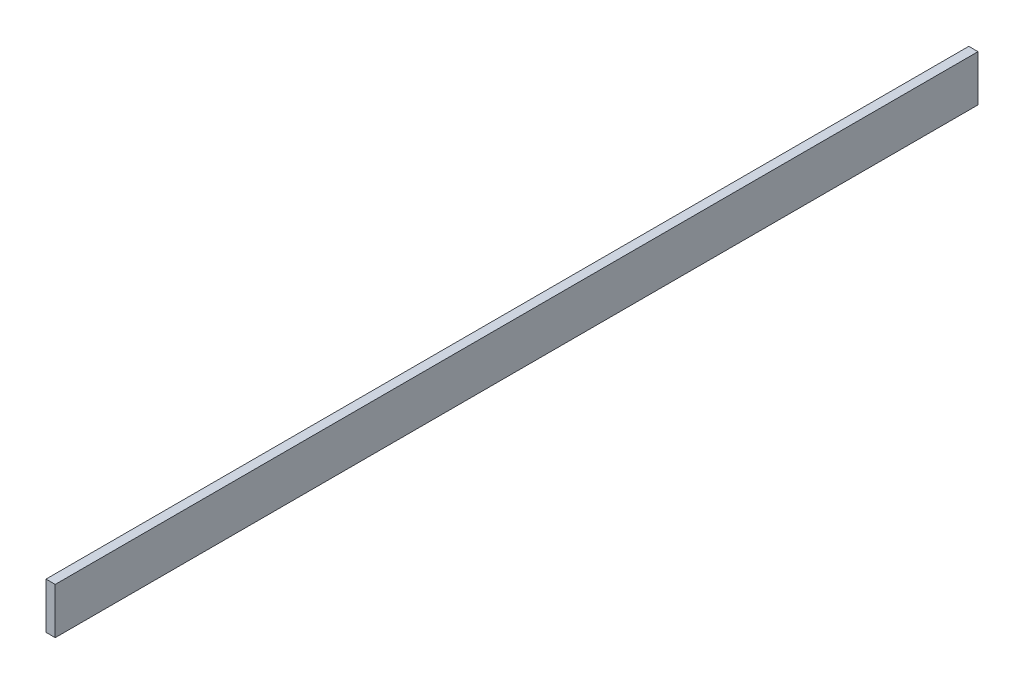
ISO-10303-21;
HEADER;
FILE_DESCRIPTION(('STEP AP214'),'2;1');
FILE_NAME('part.step','',(''),(''),'','','');
FILE_SCHEMA(('AUTOMOTIVE_DESIGN { 1 0 10303 214 1 1 1 1 }'));
ENDSEC;
DATA;
#1=APPLICATION_CONTEXT('core data for automotive mechanical design processes');
#2=APPLICATION_PROTOCOL_DEFINITION('international standard','automotive_design',2000,#1);
#3=PRODUCT_CONTEXT('',#1,'mechanical');
#4=PRODUCT('Part','Part','',(#3));
#5=PRODUCT_RELATED_PRODUCT_CATEGORY('part','',(#4));
#6=PRODUCT_DEFINITION_FORMATION('','',#4);
#7=PRODUCT_DEFINITION_CONTEXT('part definition',#1,'design');
#8=PRODUCT_DEFINITION('design','',#6,#7);
#9=PRODUCT_DEFINITION_SHAPE('','',#8);
#10=(LENGTH_UNIT() NAMED_UNIT(*) SI_UNIT(.MILLI.,.METRE.));
#11=(NAMED_UNIT(*) PLANE_ANGLE_UNIT() SI_UNIT($,.RADIAN.));
#12=(NAMED_UNIT(*) SI_UNIT($,.STERADIAN.) SOLID_ANGLE_UNIT());
#13=UNCERTAINTY_MEASURE_WITH_UNIT(LENGTH_MEASURE(1.E-05),#10,'distance_accuracy_value','');
#14=(GEOMETRIC_REPRESENTATION_CONTEXT(3) GLOBAL_UNCERTAINTY_ASSIGNED_CONTEXT((#13)) GLOBAL_UNIT_ASSIGNED_CONTEXT((#10,
#11,#12)) REPRESENTATION_CONTEXT('',''));
#15=CARTESIAN_POINT('',(0.,0.,0.));
#16=DIRECTION('',(0.,0.,1.));
#17=DIRECTION('',(1.,0.,0.));
#18=AXIS2_PLACEMENT_3D('',#15,#16,#17);
#19=CARTESIAN_POINT('',(9.99999999999999,50.,2000.));
#20=DIRECTION('',(-1.,0.,0.));
#21=DIRECTION('',(0.,-1.,0.));
#22=AXIS2_PLACEMENT_3D('',#19,#20,#21);
#23=PLANE('',#22);
#24=DIRECTION('',(0.,1.,0.));
#25=VECTOR('',#24,1.);
#26=CARTESIAN_POINT('',(9.99999999999999,50.,0.));
#27=LINE('',#26,#25);
#28=CARTESIAN_POINT('',(10.,-50.,0.));
#29=VERTEX_POINT('',#28);
#30=CARTESIAN_POINT('',(9.99999999999999,50.,0.));
#31=VERTEX_POINT('',#30);
#32=EDGE_CURVE('E98',#29,#31,#27,.T.);
#33=ORIENTED_EDGE('',*,*,#32,.T.);
#34=DIRECTION('',(0.,0.,-1.));
#35=VECTOR('',#34,1.);
#36=CARTESIAN_POINT('',(9.99999999999999,50.,2000.));
#37=LINE('',#36,#35);
#38=CARTESIAN_POINT('',(9.99999999999999,50.,2000.));
#39=VERTEX_POINT('',#38);
#40=EDGE_CURVE('E11',#39,#31,#37,.T.);
#41=ORIENTED_EDGE('',*,*,#40,.F.);
#42=DIRECTION('',(0.,1.,0.));
#43=VECTOR('',#42,1.);
#44=CARTESIAN_POINT('',(9.99999999999999,50.,2000.));
#45=LINE('',#44,#43);
#46=CARTESIAN_POINT('',(10.,-50.,2000.));
#47=VERTEX_POINT('',#46);
#48=EDGE_CURVE('E86',#47,#39,#45,.T.);
#49=ORIENTED_EDGE('',*,*,#48,.F.);
#50=DIRECTION('',(0.,0.,-1.));
#51=VECTOR('',#50,1.);
#52=CARTESIAN_POINT('',(10.,-50.,2000.));
#53=LINE('',#52,#51);
#54=EDGE_CURVE('E94',#47,#29,#53,.T.);
#55=ORIENTED_EDGE('',*,*,#54,.T.);
#56=EDGE_LOOP('',(#33,#41,#49,#55));
#57=FACE_BOUND('',#56,.T.);
#58=ADVANCED_FACE('F35',(#57),#23,.F.);
#59=CARTESIAN_POINT('',(-10.,50.,2000.));
#60=DIRECTION('',(0.,-1.,0.));
#61=DIRECTION('',(0.,0.,-1.));
#62=AXIS2_PLACEMENT_3D('',#59,#60,#61);
#63=PLANE('',#62);
#64=DIRECTION('',(-1.,0.,0.));
#65=VECTOR('',#64,1.);
#66=CARTESIAN_POINT('',(-10.,50.,0.));
#67=LINE('',#66,#65);
#68=CARTESIAN_POINT('',(-10.,50.,0.));
#69=VERTEX_POINT('',#68);
#70=EDGE_CURVE('E90',#31,#69,#67,.T.);
#71=ORIENTED_EDGE('',*,*,#70,.T.);
#72=DIRECTION('',(0.,0.,-1.));
#73=VECTOR('',#72,1.);
#74=CARTESIAN_POINT('',(-10.,50.,2000.));
#75=LINE('',#74,#73);
#76=CARTESIAN_POINT('',(-10.,50.,2000.));
#77=VERTEX_POINT('',#76);
#78=EDGE_CURVE('E43',#77,#69,#75,.T.);
#79=ORIENTED_EDGE('',*,*,#78,.F.);
#80=DIRECTION('',(-1.,0.,0.));
#81=VECTOR('',#80,1.);
#82=CARTESIAN_POINT('',(-10.,50.,2000.));
#83=LINE('',#82,#81);
#84=EDGE_CURVE('E81',#39,#77,#83,.T.);
#85=ORIENTED_EDGE('',*,*,#84,.F.);
#86=ORIENTED_EDGE('',*,*,#40,.T.);
#87=EDGE_LOOP('',(#71,#79,#85,#86));
#88=FACE_BOUND('',#87,.T.);
#89=ADVANCED_FACE('F89',(#88),#63,.F.);
#90=CARTESIAN_POINT('',(-10.,50.,2000.));
#91=DIRECTION('',(1.,0.,0.));
#92=DIRECTION('',(0.,1.,0.));
#93=AXIS2_PLACEMENT_3D('',#90,#91,#92);
#94=PLANE('',#93);
#95=DIRECTION('',(0.,-1.,0.));
#96=VECTOR('',#95,1.);
#97=CARTESIAN_POINT('',(-10.,50.,0.));
#98=LINE('',#97,#96);
#99=CARTESIAN_POINT('',(-9.99999999999999,-50.,0.));
#100=VERTEX_POINT('',#99);
#101=EDGE_CURVE('E68',#69,#100,#98,.T.);
#102=ORIENTED_EDGE('',*,*,#101,.T.);
#103=DIRECTION('',(0.,0.,-1.));
#104=VECTOR('',#103,1.);
#105=CARTESIAN_POINT('',(-9.99999999999999,-50.,2000.));
#106=LINE('',#105,#104);
#107=CARTESIAN_POINT('',(-9.99999999999999,-50.,2000.));
#108=VERTEX_POINT('',#107);
#109=EDGE_CURVE('E91',#108,#100,#106,.T.);
#110=ORIENTED_EDGE('',*,*,#109,.F.);
#111=DIRECTION('',(0.,-1.,0.));
#112=VECTOR('',#111,1.);
#113=CARTESIAN_POINT('',(-10.,50.,2000.));
#114=LINE('',#113,#112);
#115=EDGE_CURVE('E84',#77,#108,#114,.T.);
#116=ORIENTED_EDGE('',*,*,#115,.F.);
#117=ORIENTED_EDGE('',*,*,#78,.T.);
#118=EDGE_LOOP('',(#102,#110,#116,#117));
#119=FACE_BOUND('',#118,.T.);
#120=ADVANCED_FACE('F92',(#119),#94,.F.);
#121=CARTESIAN_POINT('',(-9.99999999999999,-50.,2000.));
#122=DIRECTION('',(0.,1.,0.));
#123=DIRECTION('',(0.,0.,1.));
#124=AXIS2_PLACEMENT_3D('',#121,#122,#123);
#125=PLANE('',#124);
#126=DIRECTION('',(1.,0.,0.));
#127=VECTOR('',#126,1.);
#128=CARTESIAN_POINT('',(-9.99999999999999,-50.,0.));
#129=LINE('',#128,#127);
#130=EDGE_CURVE('E74',#100,#29,#129,.T.);
#131=ORIENTED_EDGE('',*,*,#130,.T.);
#132=ORIENTED_EDGE('',*,*,#54,.F.);
#133=DIRECTION('',(1.,0.,0.));
#134=VECTOR('',#133,1.);
#135=CARTESIAN_POINT('',(-9.99999999999999,-50.,2000.));
#136=LINE('',#135,#134);
#137=EDGE_CURVE('E51',#108,#47,#136,.T.);
#138=ORIENTED_EDGE('',*,*,#137,.F.);
#139=ORIENTED_EDGE('',*,*,#109,.T.);
#140=EDGE_LOOP('',(#131,#132,#138,#139));
#141=FACE_BOUND('',#140,.T.);
#142=ADVANCED_FACE('F105',(#141),#125,.F.);
#143=CARTESIAN_POINT('',(0.,0.,2000.));
#144=DIRECTION('',(0.,0.,1.));
#145=DIRECTION('',(1.,0.,0.));
#146=AXIS2_PLACEMENT_3D('',#143,#144,#145);
#147=PLANE('',#146);
#148=ORIENTED_EDGE('',*,*,#48,.T.);
#149=ORIENTED_EDGE('',*,*,#84,.T.);
#150=ORIENTED_EDGE('',*,*,#115,.T.);
#151=ORIENTED_EDGE('',*,*,#137,.T.);
#152=EDGE_LOOP('',(#148,#149,#150,#151));
#153=FACE_BOUND('',#152,.T.);
#154=ADVANCED_FACE('F82',(#153),#147,.T.);
#155=CARTESIAN_POINT('',(0.,0.,0.));
#156=DIRECTION('',(0.,0.,1.));
#157=DIRECTION('',(1.,0.,0.));
#158=AXIS2_PLACEMENT_3D('',#155,#156,#157);
#159=PLANE('',#158);
#160=ORIENTED_EDGE('',*,*,#32,.F.);
#161=ORIENTED_EDGE('',*,*,#130,.F.);
#162=ORIENTED_EDGE('',*,*,#101,.F.);
#163=ORIENTED_EDGE('',*,*,#70,.F.);
#164=EDGE_LOOP('',(#160,#161,#162,#163));
#165=FACE_BOUND('',#164,.T.);
#166=ADVANCED_FACE('F108',(#165),#159,.F.);
#167=CLOSED_SHELL('',(#58,#89,#120,#142,#154,#166));
#168=MANIFOLD_SOLID_BREP('B2',#167);
#169=ADVANCED_BREP_SHAPE_REPRESENTATION('',(#18,#168),#14);
#170=SHAPE_DEFINITION_REPRESENTATION(#9,#169);
ENDSEC;
END-ISO-10303-21;
